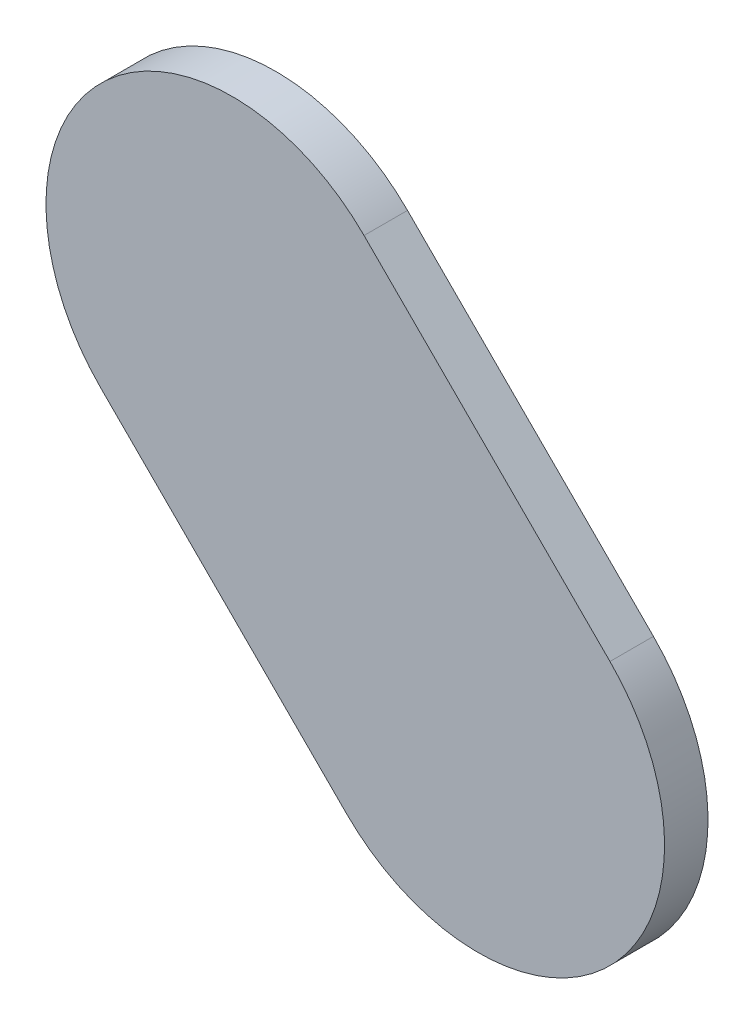
ISO-10303-21;
HEADER;
FILE_DESCRIPTION(('STEP AP214'),'2;1');
FILE_NAME('part.step','',(''),(''),'','','');
FILE_SCHEMA(('AUTOMOTIVE_DESIGN { 1 0 10303 214 1 1 1 1 }'));
ENDSEC;
DATA;
#1=APPLICATION_CONTEXT('core data for automotive mechanical design processes');
#2=APPLICATION_PROTOCOL_DEFINITION('international standard','automotive_design',2000,#1);
#3=PRODUCT_CONTEXT('',#1,'mechanical');
#4=PRODUCT('Part','Part','',(#3));
#5=PRODUCT_RELATED_PRODUCT_CATEGORY('part','',(#4));
#6=PRODUCT_DEFINITION_FORMATION('','',#4);
#7=PRODUCT_DEFINITION_CONTEXT('part definition',#1,'design');
#8=PRODUCT_DEFINITION('design','',#6,#7);
#9=PRODUCT_DEFINITION_SHAPE('','',#8);
#10=(LENGTH_UNIT() NAMED_UNIT(*) SI_UNIT(.MILLI.,.METRE.));
#11=(NAMED_UNIT(*) PLANE_ANGLE_UNIT() SI_UNIT($,.RADIAN.));
#12=(NAMED_UNIT(*) SI_UNIT($,.STERADIAN.) SOLID_ANGLE_UNIT());
#13=UNCERTAINTY_MEASURE_WITH_UNIT(LENGTH_MEASURE(1.E-05),#10,'distance_accuracy_value','');
#14=(GEOMETRIC_REPRESENTATION_CONTEXT(3) GLOBAL_UNCERTAINTY_ASSIGNED_CONTEXT((#13)) GLOBAL_UNIT_ASSIGNED_CONTEXT((#10,
#11,#12)) REPRESENTATION_CONTEXT('',''));
#15=CARTESIAN_POINT('',(0.,0.,0.));
#16=DIRECTION('',(0.,0.,1.));
#17=DIRECTION('',(1.,0.,0.));
#18=AXIS2_PLACEMENT_3D('',#15,#16,#17);
#19=CARTESIAN_POINT('',(150.906066,-113.488933,1.635));
#20=DIRECTION('',(0.,0.,1.));
#21=DIRECTION('',(1.,0.,0.));
#22=AXIS2_PLACEMENT_3D('',#19,#20,#21);
#23=PLANE('',#22);
#24=DIRECTION('',(-0.707106781186548,0.707106781186548,0.));
#25=VECTOR('',#24,1.);
#26=CARTESIAN_POINT('',(150.906066,-113.488933,1.635));
#27=LINE('',#26,#25);
#28=CARTESIAN_POINT('',(150.906066,-113.488933,1.635));
#29=VERTEX_POINT('',#28);
#30=CARTESIAN_POINT('',(150.708066,-113.290933,1.635));
#31=VERTEX_POINT('',#30);
#32=EDGE_CURVE('E82',#29,#31,#27,.T.);
#33=ORIENTED_EDGE('',*,*,#32,.T.);
#34=CARTESIAN_POINT('',(150.6019995,-113.3969995,1.635));
#35=DIRECTION('',(0.,0.,1.));
#36=DIRECTION('',(0.707106781186548,0.707106781186548,0.));
#37=AXIS2_PLACEMENT_3D('',#34,#35,#36);
#38=CIRCLE('',#37,0.150000682813);
#39=CARTESIAN_POINT('',(150.495933,-113.503066,1.635));
#40=VERTEX_POINT('',#39);
#41=EDGE_CURVE('E97',#31,#40,#38,.T.);
#42=ORIENTED_EDGE('',*,*,#41,.T.);
#43=DIRECTION('',(0.707106781186548,-0.707106781186548,0.));
#44=VECTOR('',#43,1.);
#45=CARTESIAN_POINT('',(150.495933,-113.503066,1.635));
#46=LINE('',#45,#44);
#47=CARTESIAN_POINT('',(150.693933,-113.701066,1.635));
#48=VERTEX_POINT('',#47);
#49=EDGE_CURVE('E75',#40,#48,#46,.T.);
#50=ORIENTED_EDGE('',*,*,#49,.T.);
#51=CARTESIAN_POINT('',(150.7999995,-113.5949995,1.635));
#52=DIRECTION('',(0.,0.,1.));
#53=DIRECTION('',(-0.707106781187048,-0.707106781186048,0.));
#54=AXIS2_PLACEMENT_3D('',#51,#52,#53);
#55=CIRCLE('',#54,0.150000682813);
#56=EDGE_CURVE('E11',#48,#29,#55,.T.);
#57=ORIENTED_EDGE('',*,*,#56,.T.);
#58=EDGE_LOOP('',(#33,#42,#50,#57));
#59=FACE_BOUND('',#58,.T.);
#60=ADVANCED_FACE('F17',(#59),#23,.T.);
#61=CARTESIAN_POINT('',(150.906066,-113.488933,1.6));
#62=DIRECTION('',(0.,0.,1.));
#63=DIRECTION('',(1.,0.,0.));
#64=AXIS2_PLACEMENT_3D('',#61,#62,#63);
#65=PLANE('',#64);
#66=CARTESIAN_POINT('',(150.7999995,-113.5949995,1.6));
#67=DIRECTION('',(0.,0.,1.));
#68=DIRECTION('',(-0.707106781187048,-0.707106781186048,0.));
#69=AXIS2_PLACEMENT_3D('',#66,#67,#68);
#70=CIRCLE('',#69,0.150000682813);
#71=CARTESIAN_POINT('',(150.693933,-113.701066,1.6));
#72=VERTEX_POINT('',#71);
#73=CARTESIAN_POINT('',(150.906066,-113.488933,1.6));
#74=VERTEX_POINT('',#73);
#75=EDGE_CURVE('E26',#72,#74,#70,.T.);
#76=ORIENTED_EDGE('',*,*,#75,.F.);
#77=DIRECTION('',(0.707106781186548,-0.707106781186548,0.));
#78=VECTOR('',#77,1.);
#79=CARTESIAN_POINT('',(150.495933,-113.503066,1.6));
#80=LINE('',#79,#78);
#81=CARTESIAN_POINT('',(150.495933,-113.503066,1.6));
#82=VERTEX_POINT('',#81);
#83=EDGE_CURVE('E100',#82,#72,#80,.T.);
#84=ORIENTED_EDGE('',*,*,#83,.F.);
#85=CARTESIAN_POINT('',(150.6019995,-113.3969995,1.6));
#86=DIRECTION('',(0.,0.,1.));
#87=DIRECTION('',(0.707106781186548,0.707106781186548,0.));
#88=AXIS2_PLACEMENT_3D('',#85,#86,#87);
#89=CIRCLE('',#88,0.150000682813);
#90=CARTESIAN_POINT('',(150.708066,-113.290933,1.6));
#91=VERTEX_POINT('',#90);
#92=EDGE_CURVE('E84',#91,#82,#89,.T.);
#93=ORIENTED_EDGE('',*,*,#92,.F.);
#94=DIRECTION('',(-0.707106781186548,0.707106781186548,0.));
#95=VECTOR('',#94,1.);
#96=CARTESIAN_POINT('',(150.906066,-113.488933,1.6));
#97=LINE('',#96,#95);
#98=EDGE_CURVE('E80',#74,#91,#97,.T.);
#99=ORIENTED_EDGE('',*,*,#98,.F.);
#100=EDGE_LOOP('',(#76,#84,#93,#99));
#101=FACE_BOUND('',#100,.T.);
#102=ADVANCED_FACE('F19',(#101),#65,.F.);
#103=CARTESIAN_POINT('',(150.7999995,-113.5949995,1.6));
#104=DIRECTION('',(0.,0.,-1.));
#105=DIRECTION('',(-0.707106781187048,-0.707106781186048,0.));
#106=AXIS2_PLACEMENT_3D('',#103,#104,#105);
#107=CYLINDRICAL_SURFACE('',#106,0.150000682813);
#108=ORIENTED_EDGE('',*,*,#75,.T.);
#109=DIRECTION('',(0.,0.,1.));
#110=VECTOR('',#109,1.);
#111=CARTESIAN_POINT('',(150.906066,-113.488933,1.6));
#112=LINE('',#111,#110);
#113=EDGE_CURVE('E69',#74,#29,#112,.T.);
#114=ORIENTED_EDGE('',*,*,#113,.T.);
#115=ORIENTED_EDGE('',*,*,#56,.F.);
#116=DIRECTION('',(0.,0.,1.));
#117=VECTOR('',#116,1.);
#118=CARTESIAN_POINT('',(150.693933,-113.701066,1.6));
#119=LINE('',#118,#117);
#120=EDGE_CURVE('E72',#72,#48,#119,.T.);
#121=ORIENTED_EDGE('',*,*,#120,.F.);
#122=EDGE_LOOP('',(#108,#114,#115,#121));
#123=FACE_BOUND('',#122,.T.);
#124=ADVANCED_FACE('F68',(#123),#107,.T.);
#125=CARTESIAN_POINT('',(150.495933,-113.503066,1.6));
#126=DIRECTION('',(0.707106781186548,0.707106781186548,0.));
#127=DIRECTION('',(0.,0.,-1.));
#128=AXIS2_PLACEMENT_3D('',#125,#126,#127);
#129=PLANE('',#128);
#130=ORIENTED_EDGE('',*,*,#83,.T.);
#131=ORIENTED_EDGE('',*,*,#120,.T.);
#132=ORIENTED_EDGE('',*,*,#49,.F.);
#133=DIRECTION('',(0.,0.,1.));
#134=VECTOR('',#133,1.);
#135=CARTESIAN_POINT('',(150.495933,-113.503066,1.6));
#136=LINE('',#135,#134);
#137=EDGE_CURVE('E101',#82,#40,#136,.T.);
#138=ORIENTED_EDGE('',*,*,#137,.F.);
#139=EDGE_LOOP('',(#130,#131,#132,#138));
#140=FACE_BOUND('',#139,.T.);
#141=ADVANCED_FACE('F118',(#140),#129,.F.);
#142=CARTESIAN_POINT('',(150.6019995,-113.3969995,1.6));
#143=DIRECTION('',(0.,0.,-1.));
#144=DIRECTION('',(0.707106781186548,0.707106781186548,0.));
#145=AXIS2_PLACEMENT_3D('',#142,#143,#144);
#146=CYLINDRICAL_SURFACE('',#145,0.150000682813);
#147=ORIENTED_EDGE('',*,*,#92,.T.);
#148=ORIENTED_EDGE('',*,*,#137,.T.);
#149=ORIENTED_EDGE('',*,*,#41,.F.);
#150=DIRECTION('',(0.,0.,1.));
#151=VECTOR('',#150,1.);
#152=CARTESIAN_POINT('',(150.708066,-113.290933,1.6));
#153=LINE('',#152,#151);
#154=EDGE_CURVE('E89',#91,#31,#153,.T.);
#155=ORIENTED_EDGE('',*,*,#154,.F.);
#156=EDGE_LOOP('',(#147,#148,#149,#155));
#157=FACE_BOUND('',#156,.T.);
#158=ADVANCED_FACE('F121',(#157),#146,.T.);
#159=CARTESIAN_POINT('',(150.906066,-113.488933,1.6));
#160=DIRECTION('',(-0.707106781186548,-0.707106781186548,0.));
#161=DIRECTION('',(-0.707106781186548,0.707106781186548,0.));
#162=AXIS2_PLACEMENT_3D('',#159,#160,#161);
#163=PLANE('',#162);
#164=ORIENTED_EDGE('',*,*,#98,.T.);
#165=ORIENTED_EDGE('',*,*,#154,.T.);
#166=ORIENTED_EDGE('',*,*,#32,.F.);
#167=ORIENTED_EDGE('',*,*,#113,.F.);
#168=EDGE_LOOP('',(#164,#165,#166,#167));
#169=FACE_BOUND('',#168,.T.);
#170=ADVANCED_FACE('F78',(#169),#163,.F.);
#171=CLOSED_SHELL('',(#60,#102,#124,#141,#158,#170));
#172=MANIFOLD_SOLID_BREP('B1',#171);
#173=ADVANCED_BREP_SHAPE_REPRESENTATION('',(#18,#172),#14);
#174=SHAPE_DEFINITION_REPRESENTATION(#9,#173);
ENDSEC;
END-ISO-10303-21;
